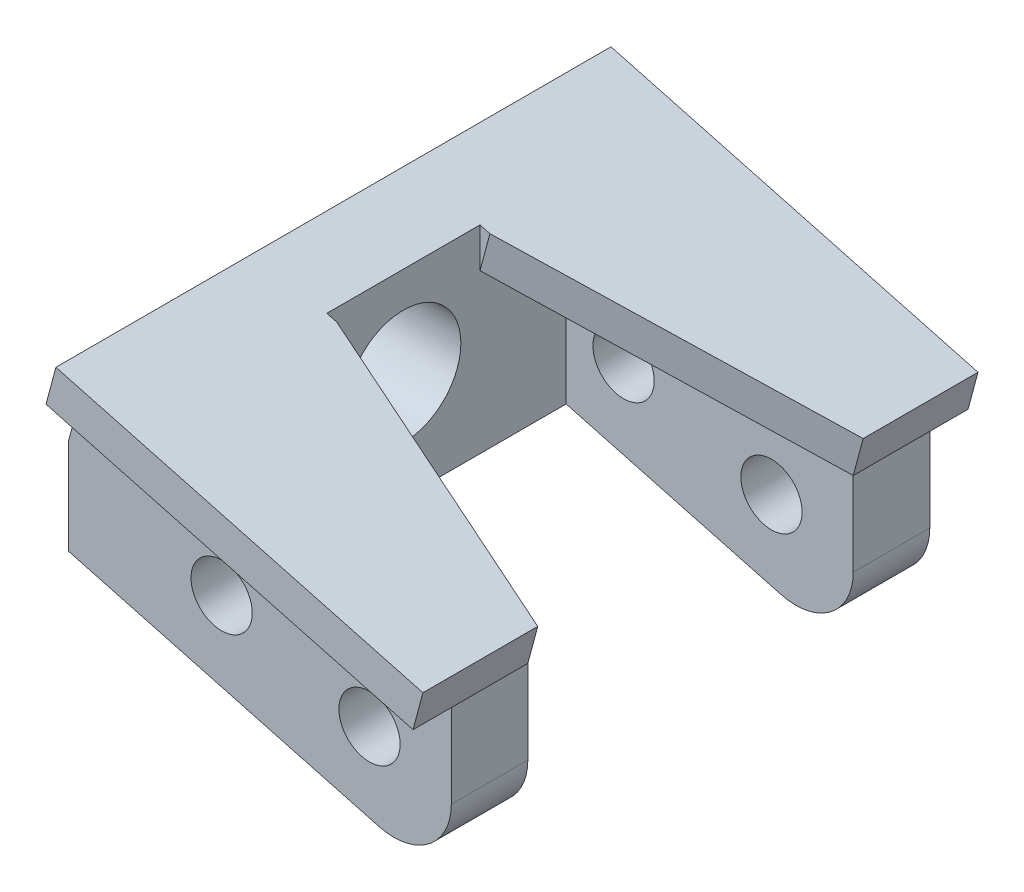
ISO-10303-21;
HEADER;
FILE_DESCRIPTION(('STEP AP214'),'2;1');
FILE_NAME('part.step','',(''),(''),'','','');
FILE_SCHEMA(('AUTOMOTIVE_DESIGN { 1 0 10303 214 1 1 1 1 }'));
ENDSEC;
DATA;
#1=APPLICATION_CONTEXT('core data for automotive mechanical design processes');
#2=APPLICATION_PROTOCOL_DEFINITION('international standard','automotive_design',2000,#1);
#3=PRODUCT_CONTEXT('',#1,'mechanical');
#4=PRODUCT('Part','Part','',(#3));
#5=PRODUCT_RELATED_PRODUCT_CATEGORY('part','',(#4));
#6=PRODUCT_DEFINITION_FORMATION('','',#4);
#7=PRODUCT_DEFINITION_CONTEXT('part definition',#1,'design');
#8=PRODUCT_DEFINITION('design','',#6,#7);
#9=PRODUCT_DEFINITION_SHAPE('','',#8);
#10=(LENGTH_UNIT() NAMED_UNIT(*) SI_UNIT(.MILLI.,.METRE.));
#11=(NAMED_UNIT(*) PLANE_ANGLE_UNIT() SI_UNIT($,.RADIAN.));
#12=(NAMED_UNIT(*) SI_UNIT($,.STERADIAN.) SOLID_ANGLE_UNIT());
#13=UNCERTAINTY_MEASURE_WITH_UNIT(LENGTH_MEASURE(1.E-05),#10,'distance_accuracy_value','');
#14=(GEOMETRIC_REPRESENTATION_CONTEXT(3) GLOBAL_UNCERTAINTY_ASSIGNED_CONTEXT((#13)) GLOBAL_UNIT_ASSIGNED_CONTEXT((#10,
#11,#12)) REPRESENTATION_CONTEXT('',''));
#15=CARTESIAN_POINT('',(0.,0.,0.));
#16=DIRECTION('',(0.,0.,1.));
#17=DIRECTION('',(1.,0.,0.));
#18=AXIS2_PLACEMENT_3D('',#15,#16,#17);
#19=CARTESIAN_POINT('',(1.892638090205,7.06342151298536,0.));
#20=DIRECTION('',(0.258819045102514,0.96592582628907,0.));
#21=DIRECTION('',(-0.96592582628907,0.258819045102514,0.));
#22=AXIS2_PLACEMENT_3D('',#19,#20,#21);
#23=PLANE('',#22);
#24=DIRECTION('',(-0.927758448091127,0.248592126937163,-0.278327534427338));
#25=VECTOR('',#24,1.);
#26=CARTESIAN_POINT('',(20.517638090205,2.07286780395583,8.5));
#27=LINE('',#26,#25);
#28=CARTESIAN_POINT('',(20.517638090205,2.07286780395583,8.5));
#29=VERTEX_POINT('',#28);
#30=CARTESIAN_POINT('',(5.51763809020503,6.09210569042256,4.));
#31=VERTEX_POINT('',#30);
#32=EDGE_CURVE('E205',#29,#31,#27,.T.);
#33=ORIENTED_EDGE('',*,*,#32,.T.);
#34=DIRECTION('',(-0.96592582628907,0.258819045102514,0.));
#35=VECTOR('',#34,1.);
#36=CARTESIAN_POINT('',(1.892638090205,7.06342151298536,4.));
#37=LINE('',#36,#35);
#38=CARTESIAN_POINT('',(5.,6.23080639866458,4.));
#39=VERTEX_POINT('',#38);
#40=EDGE_CURVE('E316',#31,#39,#37,.T.);
#41=ORIENTED_EDGE('',*,*,#40,.T.);
#42=DIRECTION('',(0.,0.,1.));
#43=VECTOR('',#42,1.);
#44=CARTESIAN_POINT('',(5.,6.23080639866458,0.));
#45=LINE('',#44,#43);
#46=CARTESIAN_POINT('',(5.,6.23080639866458,-4.));
#47=VERTEX_POINT('',#46);
#48=EDGE_CURVE('E178',#47,#39,#45,.T.);
#49=ORIENTED_EDGE('',*,*,#48,.F.);
#50=DIRECTION('',(0.96592582628907,-0.258819045102514,0.));
#51=VECTOR('',#50,1.);
#52=CARTESIAN_POINT('',(1.892638090205,7.06342151298536,-4.));
#53=LINE('',#52,#51);
#54=CARTESIAN_POINT('',(5.51763809020501,6.09210569042257,-4.));
#55=VERTEX_POINT('',#54);
#56=EDGE_CURVE('E175',#47,#55,#53,.T.);
#57=ORIENTED_EDGE('',*,*,#56,.T.);
#58=DIRECTION('',(0.927758448091127,-0.248592126937163,-0.278327534427338));
#59=VECTOR('',#58,1.);
#60=CARTESIAN_POINT('',(20.517638090205,2.07286780395583,-8.5));
#61=LINE('',#60,#59);
#62=CARTESIAN_POINT('',(20.517638090205,2.07286780395583,-8.5));
#63=VERTEX_POINT('',#62);
#64=EDGE_CURVE('E203',#55,#63,#61,.T.);
#65=ORIENTED_EDGE('',*,*,#64,.T.);
#66=DIRECTION('',(0.,0.,-1.));
#67=VECTOR('',#66,1.);
#68=CARTESIAN_POINT('',(20.517638090205,2.07286780395583,-8.5));
#69=LINE('',#68,#67);
#70=CARTESIAN_POINT('',(20.517638090205,2.07286780395583,-14.5));
#71=VERTEX_POINT('',#70);
#72=EDGE_CURVE('E354',#63,#71,#69,.T.);
#73=ORIENTED_EDGE('',*,*,#72,.T.);
#74=DIRECTION('',(-0.96592582628907,0.258819045102514,0.));
#75=VECTOR('',#74,1.);
#76=CARTESIAN_POINT('',(20.517638090205,2.07286780395583,-14.5));
#77=LINE('',#76,#75);
#78=CARTESIAN_POINT('',(1.34254474715799,7.21081858001654,-14.5));
#79=VERTEX_POINT('',#78);
#80=EDGE_CURVE('E358',#71,#79,#77,.T.);
#81=ORIENTED_EDGE('',*,*,#80,.T.);
#82=DIRECTION('',(0.,0.,1.));
#83=VECTOR('',#82,1.);
#84=CARTESIAN_POINT('',(1.34254474715799,7.21081858001654,-14.5));
#85=LINE('',#84,#83);
#86=CARTESIAN_POINT('',(1.34254474715799,7.21081858001654,14.5));
#87=VERTEX_POINT('',#86);
#88=EDGE_CURVE('E407',#79,#87,#85,.T.);
#89=ORIENTED_EDGE('',*,*,#88,.T.);
#90=DIRECTION('',(0.96592582628907,-0.258819045102514,0.));
#91=VECTOR('',#90,1.);
#92=CARTESIAN_POINT('',(20.517638090205,2.07286780395583,14.5));
#93=LINE('',#92,#91);
#94=CARTESIAN_POINT('',(20.517638090205,2.07286780395583,14.5));
#95=VERTEX_POINT('',#94);
#96=EDGE_CURVE('E365',#87,#95,#93,.T.);
#97=ORIENTED_EDGE('',*,*,#96,.T.);
#98=DIRECTION('',(0.,0.,-1.));
#99=VECTOR('',#98,1.);
#100=CARTESIAN_POINT('',(20.517638090205,2.07286780395583,8.5));
#101=LINE('',#100,#99);
#102=EDGE_CURVE('E366',#95,#29,#101,.T.);
#103=ORIENTED_EDGE('',*,*,#102,.T.);
#104=EDGE_LOOP('',(#33,#41,#49,#57,#65,#73,#81,#89,#97,#103));
#105=FACE_BOUND('',#104,.T.);
#106=ADVANCED_FACE('F34',(#105),#23,.T.);
#107=CARTESIAN_POINT('',(5.,0.,0.));
#108=DIRECTION('',(1.,0.,0.));
#109=DIRECTION('',(0.,0.,-1.));
#110=AXIS2_PLACEMENT_3D('',#107,#108,#109);
#111=PLANE('',#110);
#112=DIRECTION('',(0.,-1.,0.));
#113=VECTOR('',#112,1.);
#114=CARTESIAN_POINT('',(5.,0.486029968612696,4.));
#115=LINE('',#114,#113);
#116=CARTESIAN_POINT('',(5.,4.16025403784442,4.));
#117=VERTEX_POINT('',#116);
#118=EDGE_CURVE('E179',#39,#117,#115,.T.);
#119=ORIENTED_EDGE('',*,*,#118,.T.);
#120=DIRECTION('',(0.,0.,-1.));
#121=VECTOR('',#120,1.);
#122=CARTESIAN_POINT('',(5.,4.16025403784442,0.));
#123=LINE('',#122,#121);
#124=CARTESIAN_POINT('',(5.,4.16025403784442,8.5));
#125=VERTEX_POINT('',#124);
#126=EDGE_CURVE('E193',#125,#117,#123,.T.);
#127=ORIENTED_EDGE('',*,*,#126,.F.);
#128=DIRECTION('',(0.,1.,0.));
#129=VECTOR('',#128,1.);
#130=CARTESIAN_POINT('',(5.,-9.5,8.5));
#131=LINE('',#130,#129);
#132=CARTESIAN_POINT('',(5.,-4.12195540543623,8.5));
#133=VERTEX_POINT('',#132);
#134=EDGE_CURVE('E301',#133,#125,#131,.T.);
#135=ORIENTED_EDGE('',*,*,#134,.F.);
#136=DIRECTION('',(0.,0.,1.));
#137=VECTOR('',#136,1.);
#138=CARTESIAN_POINT('',(5.,-4.12195540543623,0.));
#139=LINE('',#138,#137);
#140=CARTESIAN_POINT('',(5.,-4.12195540543623,-8.5));
#141=VERTEX_POINT('',#140);
#142=EDGE_CURVE('E277',#141,#133,#139,.T.);
#143=ORIENTED_EDGE('',*,*,#142,.F.);
#144=DIRECTION('',(0.,-1.,0.));
#145=VECTOR('',#144,1.);
#146=CARTESIAN_POINT('',(5.,-9.5,-8.5));
#147=LINE('',#146,#145);
#148=CARTESIAN_POINT('',(5.,4.16025403784442,-8.5));
#149=VERTEX_POINT('',#148);
#150=EDGE_CURVE('E189',#149,#141,#147,.T.);
#151=ORIENTED_EDGE('',*,*,#150,.F.);
#152=CARTESIAN_POINT('',(5.,4.16025403784442,-4.));
#153=VERTEX_POINT('',#152);
#154=EDGE_CURVE('E183',#153,#149,#123,.T.);
#155=ORIENTED_EDGE('',*,*,#154,.F.);
#156=DIRECTION('',(0.,1.,0.));
#157=VECTOR('',#156,1.);
#158=CARTESIAN_POINT('',(5.,6.74992068412596,-4.));
#159=LINE('',#158,#157);
#160=EDGE_CURVE('E169',#153,#47,#159,.T.);
#161=ORIENTED_EDGE('',*,*,#160,.T.);
#162=ORIENTED_EDGE('',*,*,#48,.T.);
#163=EDGE_LOOP('',(#119,#127,#135,#143,#151,#155,#161,#162));
#164=FACE_BOUND('',#163,.T.);
#165=CARTESIAN_POINT('',(5.,1.37804459456377,0.));
#166=DIRECTION('',(1.,0.,0.));
#167=DIRECTION('',(0.,0.,-1.));
#168=AXIS2_PLACEMENT_3D('',#165,#166,#167);
#169=CIRCLE('',#168,3.);
#170=CARTESIAN_POINT('',(5.,1.37804459456377,-3.));
#171=VERTEX_POINT('',#170);
#172=EDGE_CURVE('E420',#171,#171,#169,.T.);
#173=ORIENTED_EDGE('',*,*,#172,.F.);
#174=EDGE_LOOP('',(#173));
#175=FACE_BOUND('',#174,.T.);
#176=ADVANCED_FACE('F185',(#164,#175),#111,.T.);
#177=CARTESIAN_POINT('',(5.,-5.5,12.5));
#178=DIRECTION('',(0.,0.,-1.));
#179=DIRECTION('',(-1.,0.,0.));
#180=AXIS2_PLACEMENT_3D('',#177,#178,#179);
#181=PLANE('',#180);
#182=CARTESIAN_POINT('',(8.,-0.784698261089253,12.5));
#183=DIRECTION('',(0.,0.,1.));
#184=DIRECTION('',(1.,0.,0.));
#185=AXIS2_PLACEMENT_3D('',#182,#183,#184);
#186=CIRCLE('',#185,1.6);
#187=CARTESIAN_POINT('',(9.6,-0.784698261089253,12.5));
#188=VERTEX_POINT('',#187);
#189=EDGE_CURVE('E252',#188,#188,#186,.T.);
#190=ORIENTED_EDGE('',*,*,#189,.F.);
#191=EDGE_LOOP('',(#190));
#192=FACE_BOUND('',#191,.T.);
#193=CARTESIAN_POINT('',(15.7274066103126,-2.85525062190937,12.5));
#194=DIRECTION('',(0.,0.,1.));
#195=DIRECTION('',(1.,0.,0.));
#196=AXIS2_PLACEMENT_3D('',#193,#194,#195);
#197=CIRCLE('',#196,1.6);
#198=CARTESIAN_POINT('',(17.3274066103126,-2.85525062190937,12.5));
#199=VERTEX_POINT('',#198);
#200=EDGE_CURVE('E256',#199,#199,#197,.T.);
#201=ORIENTED_EDGE('',*,*,#200,.F.);
#202=EDGE_LOOP('',(#201));
#203=FACE_BOUND('',#202,.T.);
#204=DIRECTION('',(-0.96592582628907,0.258819045102514,0.));
#205=VECTOR('',#204,1.);
#206=CARTESIAN_POINT('',(0.,-2.78220944328066,12.5));
#207=LINE('',#206,#205);
#208=CARTESIAN_POINT('',(16.2235428646925,-7.12929465224658,12.5));
#209=VERTEX_POINT('',#208);
#210=CARTESIAN_POINT('',(0.,-2.78220944328066,12.5));
#211=VERTEX_POINT('',#210);
#212=EDGE_CURVE('E242',#209,#211,#207,.T.);
#213=ORIENTED_EDGE('',*,*,#212,.F.);
#214=CARTESIAN_POINT('',(17.,-4.23151717337937,12.5));
#215=DIRECTION('',(0.,0.,-1.));
#216=DIRECTION('',(-1.,0.,0.));
#217=AXIS2_PLACEMENT_3D('',#214,#215,#216);
#218=CIRCLE('',#217,3.);
#219=CARTESIAN_POINT('',(20.,-4.23151717337937,12.5));
#220=VERTEX_POINT('',#219);
#221=EDGE_CURVE('E56',#209,#220,#218,.F.);
#222=ORIENTED_EDGE('',*,*,#221,.T.);
#223=DIRECTION('',(0.,-1.,0.));
#224=VECTOR('',#223,1.);
#225=CARTESIAN_POINT('',(20.,-9.5,12.5));
#226=LINE('',#225,#224);
#227=CARTESIAN_POINT('',(20.,0.141016151377685,12.5));
#228=VERTEX_POINT('',#227);
#229=EDGE_CURVE('E295',#228,#220,#226,.T.);
#230=ORIENTED_EDGE('',*,*,#229,.F.);
#231=DIRECTION('',(0.96592582628907,-0.258819045102514,0.));
#232=VECTOR('',#231,1.);
#233=CARTESIAN_POINT('',(0.,5.5,12.5));
#234=LINE('',#233,#232);
#235=CARTESIAN_POINT('',(0.824906656952962,5.2789669274384,12.5));
#236=VERTEX_POINT('',#235);
#237=EDGE_CURVE('E247',#236,#228,#234,.T.);
#238=ORIENTED_EDGE('',*,*,#237,.F.);
#239=DIRECTION('',(-0.258819045102514,-0.96592582628907,0.));
#240=VECTOR('',#239,1.);
#241=CARTESIAN_POINT('',(-1.59015685250809,-3.73417279337608,12.5));
#242=LINE('',#241,#240);
#243=CARTESIAN_POINT('',(0.,2.20037337218807,12.5));
#244=VERTEX_POINT('',#243);
#245=EDGE_CURVE('E210',#236,#244,#242,.T.);
#246=ORIENTED_EDGE('',*,*,#245,.T.);
#247=DIRECTION('',(0.,-1.,0.));
#248=VECTOR('',#247,1.);
#249=CARTESIAN_POINT('',(0.,-5.5,12.5));
#250=LINE('',#249,#248);
#251=EDGE_CURVE('E300',#244,#211,#250,.T.);
#252=ORIENTED_EDGE('',*,*,#251,.T.);
#253=EDGE_LOOP('',(#213,#222,#230,#238,#246,#252));
#254=FACE_BOUND('',#253,.T.);
#255=ADVANCED_FACE('F392',(#192,#203,#254),#181,.F.);
#256=CARTESIAN_POINT('',(5.,-5.5,-12.5));
#257=DIRECTION('',(0.,0.,1.));
#258=DIRECTION('',(1.,0.,0.));
#259=AXIS2_PLACEMENT_3D('',#256,#257,#258);
#260=PLANE('',#259);
#261=CARTESIAN_POINT('',(8.,-0.784698261089253,-12.5));
#262=DIRECTION('',(0.,0.,1.));
#263=DIRECTION('',(1.,0.,0.));
#264=AXIS2_PLACEMENT_3D('',#261,#262,#263);
#265=CIRCLE('',#264,1.6);
#266=CARTESIAN_POINT('',(9.6,-0.784698261089253,-12.5));
#267=VERTEX_POINT('',#266);
#268=EDGE_CURVE('E253',#267,#267,#265,.T.);
#269=ORIENTED_EDGE('',*,*,#268,.T.);
#270=EDGE_LOOP('',(#269));
#271=FACE_BOUND('',#270,.T.);
#272=CARTESIAN_POINT('',(15.7274066103126,-2.85525062190937,-12.5));
#273=DIRECTION('',(0.,0.,1.));
#274=DIRECTION('',(1.,0.,0.));
#275=AXIS2_PLACEMENT_3D('',#272,#273,#274);
#276=CIRCLE('',#275,1.6);
#277=CARTESIAN_POINT('',(17.3274066103126,-2.85525062190937,-12.5));
#278=VERTEX_POINT('',#277);
#279=EDGE_CURVE('E264',#278,#278,#276,.T.);
#280=ORIENTED_EDGE('',*,*,#279,.T.);
#281=EDGE_LOOP('',(#280));
#282=FACE_BOUND('',#281,.T.);
#283=DIRECTION('',(0.,1.,0.));
#284=VECTOR('',#283,1.);
#285=CARTESIAN_POINT('',(20.,-9.5,-12.5));
#286=LINE('',#285,#284);
#287=CARTESIAN_POINT('',(20.,-4.23151717337937,-12.5));
#288=VERTEX_POINT('',#287);
#289=CARTESIAN_POINT('',(20.,0.141016151377685,-12.5));
#290=VERTEX_POINT('',#289);
#291=EDGE_CURVE('E293',#288,#290,#286,.T.);
#292=ORIENTED_EDGE('',*,*,#291,.F.);
#293=CARTESIAN_POINT('',(17.,-4.23151717337937,-12.5));
#294=DIRECTION('',(0.,0.,1.));
#295=DIRECTION('',(1.,0.,0.));
#296=AXIS2_PLACEMENT_3D('',#293,#294,#295);
#297=CIRCLE('',#296,3.);
#298=CARTESIAN_POINT('',(16.2235428646925,-7.12929465224658,-12.5));
#299=VERTEX_POINT('',#298);
#300=EDGE_CURVE('E329',#288,#299,#297,.F.);
#301=ORIENTED_EDGE('',*,*,#300,.T.);
#302=DIRECTION('',(-0.96592582628907,0.258819045102514,0.));
#303=VECTOR('',#302,1.);
#304=CARTESIAN_POINT('',(0.,-2.78220944328066,-12.5));
#305=LINE('',#304,#303);
#306=CARTESIAN_POINT('',(0.,-2.78220944328066,-12.5));
#307=VERTEX_POINT('',#306);
#308=EDGE_CURVE('E259',#299,#307,#305,.T.);
#309=ORIENTED_EDGE('',*,*,#308,.T.);
#310=DIRECTION('',(0.,1.,0.));
#311=VECTOR('',#310,1.);
#312=CARTESIAN_POINT('',(0.,-5.5,-12.5));
#313=LINE('',#312,#311);
#314=CARTESIAN_POINT('',(0.,2.20037337218807,-12.5));
#315=VERTEX_POINT('',#314);
#316=EDGE_CURVE('E305',#307,#315,#313,.T.);
#317=ORIENTED_EDGE('',*,*,#316,.T.);
#318=DIRECTION('',(0.258819045102514,0.96592582628907,0.));
#319=VECTOR('',#318,1.);
#320=CARTESIAN_POINT('',(-1.59015685250808,-3.73417279337607,-12.5));
#321=LINE('',#320,#319);
#322=CARTESIAN_POINT('',(0.824906656952962,5.2789669274384,-12.5));
#323=VERTEX_POINT('',#322);
#324=EDGE_CURVE('E400',#315,#323,#321,.T.);
#325=ORIENTED_EDGE('',*,*,#324,.T.);
#326=DIRECTION('',(0.96592582628907,-0.258819045102514,0.));
#327=VECTOR('',#326,1.);
#328=CARTESIAN_POINT('',(0.,5.5,-12.5));
#329=LINE('',#328,#327);
#330=EDGE_CURVE('E243',#323,#290,#329,.T.);
#331=ORIENTED_EDGE('',*,*,#330,.T.);
#332=EDGE_LOOP('',(#292,#301,#309,#317,#325,#331));
#333=FACE_BOUND('',#332,.T.);
#334=ADVANCED_FACE('F335',(#271,#282,#333),#260,.F.);
#335=CARTESIAN_POINT('',(0.,0.,0.));
#336=DIRECTION('',(1.,0.,0.));
#337=DIRECTION('',(0.,0.,-1.));
#338=AXIS2_PLACEMENT_3D('',#335,#336,#337);
#339=PLANE('',#338);
#340=DIRECTION('',(0.,0.,1.));
#341=VECTOR('',#340,1.);
#342=CARTESIAN_POINT('',(0.,2.20037337218807,-14.5));
#343=LINE('',#342,#341);
#344=CARTESIAN_POINT('',(0.,2.20037337218807,2.88509538516336));
#345=VERTEX_POINT('',#344);
#346=EDGE_CURVE('E411',#345,#244,#343,.T.);
#347=ORIENTED_EDGE('',*,*,#346,.F.);
#348=CARTESIAN_POINT('',(0.,1.37804459456377,0.));
#349=DIRECTION('',(1.,0.,0.));
#350=DIRECTION('',(0.,0.,-1.));
#351=AXIS2_PLACEMENT_3D('',#348,#349,#350);
#352=CIRCLE('',#351,3.);
#353=CARTESIAN_POINT('',(0.,2.20037337218807,-2.88509538516336));
#354=VERTEX_POINT('',#353);
#355=EDGE_CURVE('E417',#345,#354,#352,.T.);
#356=ORIENTED_EDGE('',*,*,#355,.T.);
#357=EDGE_CURVE('E408',#315,#354,#343,.T.);
#358=ORIENTED_EDGE('',*,*,#357,.F.);
#359=ORIENTED_EDGE('',*,*,#316,.F.);
#360=DIRECTION('',(0.,0.,1.));
#361=VECTOR('',#360,1.);
#362=CARTESIAN_POINT('',(0.,-2.78220944328066,-12.5));
#363=LINE('',#362,#361);
#364=EDGE_CURVE('E249',#307,#211,#363,.T.);
#365=ORIENTED_EDGE('',*,*,#364,.T.);
#366=ORIENTED_EDGE('',*,*,#251,.F.);
#367=EDGE_LOOP('',(#347,#356,#358,#359,#365,#366));
#368=FACE_BOUND('',#367,.T.);
#369=ADVANCED_FACE('F429',(#368),#339,.F.);
#370=CARTESIAN_POINT('',(20.,-9.5,8.5));
#371=DIRECTION('',(0.,0.,1.));
#372=DIRECTION('',(1.,0.,0.));
#373=AXIS2_PLACEMENT_3D('',#370,#371,#372);
#374=PLANE('',#373);
#375=CARTESIAN_POINT('',(8.,-0.784698261089253,8.5));
#376=DIRECTION('',(0.,0.,1.));
#377=DIRECTION('',(1.,0.,0.));
#378=AXIS2_PLACEMENT_3D('',#375,#376,#377);
#379=CIRCLE('',#378,1.6);
#380=CARTESIAN_POINT('',(9.6,-0.784698261089253,8.5));
#381=VERTEX_POINT('',#380);
#382=EDGE_CURVE('E287',#381,#381,#379,.T.);
#383=ORIENTED_EDGE('',*,*,#382,.T.);
#384=EDGE_LOOP('',(#383));
#385=FACE_BOUND('',#384,.T.);
#386=CARTESIAN_POINT('',(15.7274066103126,-2.85525062190937,8.5));
#387=DIRECTION('',(0.,0.,1.));
#388=DIRECTION('',(1.,0.,0.));
#389=AXIS2_PLACEMENT_3D('',#386,#387,#388);
#390=CIRCLE('',#389,1.6);
#391=CARTESIAN_POINT('',(17.3274066103126,-2.85525062190937,8.5));
#392=VERTEX_POINT('',#391);
#393=EDGE_CURVE('E283',#392,#392,#390,.T.);
#394=ORIENTED_EDGE('',*,*,#393,.T.);
#395=EDGE_LOOP('',(#394));
#396=FACE_BOUND('',#395,.T.);
#397=DIRECTION('',(0.,1.,0.));
#398=VECTOR('',#397,1.);
#399=CARTESIAN_POINT('',(20.,-9.5,8.5));
#400=LINE('',#399,#398);
#401=CARTESIAN_POINT('',(20.,-4.23151717337937,8.5));
#402=VERTEX_POINT('',#401);
#403=CARTESIAN_POINT('',(20.,0.141016151377685,8.5));
#404=VERTEX_POINT('',#403);
#405=EDGE_CURVE('E298',#402,#404,#400,.T.);
#406=ORIENTED_EDGE('',*,*,#405,.F.);
#407=CARTESIAN_POINT('',(17.,-4.23151717337937,8.5));
#408=DIRECTION('',(0.,0.,1.));
#409=DIRECTION('',(1.,0.,0.));
#410=AXIS2_PLACEMENT_3D('',#407,#408,#409);
#411=CIRCLE('',#410,3.);
#412=CARTESIAN_POINT('',(16.2235428646925,-7.12929465224658,8.5));
#413=VERTEX_POINT('',#412);
#414=EDGE_CURVE('E11',#402,#413,#411,.F.);
#415=ORIENTED_EDGE('',*,*,#414,.T.);
#416=DIRECTION('',(-0.96592582628907,0.258819045102514,0.));
#417=VECTOR('',#416,1.);
#418=CARTESIAN_POINT('',(20.3397016770243,-8.2322160819291,8.5));
#419=LINE('',#418,#417);
#420=EDGE_CURVE('E280',#413,#133,#419,.T.);
#421=ORIENTED_EDGE('',*,*,#420,.T.);
#422=ORIENTED_EDGE('',*,*,#134,.T.);
#423=DIRECTION('',(0.96592582628907,-0.258819045102514,0.));
#424=VECTOR('',#423,1.);
#425=CARTESIAN_POINT('',(22.4102540378444,-0.504809471616548,8.5));
#426=LINE('',#425,#424);
#427=EDGE_CURVE('E271',#125,#404,#426,.T.);
#428=ORIENTED_EDGE('',*,*,#427,.T.);
#429=EDGE_LOOP('',(#406,#415,#421,#422,#428));
#430=FACE_BOUND('',#429,.T.);
#431=ADVANCED_FACE('F384',(#385,#396,#430),#374,.F.);
#432=CARTESIAN_POINT('',(20.,0.,0.));
#433=DIRECTION('',(1.,0.,0.));
#434=DIRECTION('',(0.,0.,-1.));
#435=AXIS2_PLACEMENT_3D('',#432,#433,#434);
#436=PLANE('',#435);
#437=ORIENTED_EDGE('',*,*,#229,.T.);
#438=DIRECTION('',(0.,0.,1.));
#439=VECTOR('',#438,1.);
#440=CARTESIAN_POINT('',(20.,-4.23151717337937,8.5));
#441=LINE('',#440,#439);
#442=EDGE_CURVE('E42',#220,#402,#441,.F.);
#443=ORIENTED_EDGE('',*,*,#442,.T.);
#444=ORIENTED_EDGE('',*,*,#405,.T.);
#445=DIRECTION('',(0.,0.,1.));
#446=VECTOR('',#445,1.);
#447=CARTESIAN_POINT('',(20.,0.141016151377685,-12.5));
#448=LINE('',#447,#446);
#449=EDGE_CURVE('E246',#404,#228,#448,.T.);
#450=ORIENTED_EDGE('',*,*,#449,.T.);
#451=EDGE_LOOP('',(#437,#443,#444,#450));
#452=FACE_BOUND('',#451,.T.);
#453=ADVANCED_FACE('F390',(#452),#436,.T.);
#454=CARTESIAN_POINT('',(20.,-9.5,-8.5));
#455=DIRECTION('',(0.,0.,-1.));
#456=DIRECTION('',(-1.,0.,0.));
#457=AXIS2_PLACEMENT_3D('',#454,#455,#456);
#458=PLANE('',#457);
#459=CARTESIAN_POINT('',(8.,-0.784698261089253,-8.5));
#460=DIRECTION('',(0.,0.,-1.));
#461=DIRECTION('',(-1.,0.,0.));
#462=AXIS2_PLACEMENT_3D('',#459,#460,#461);
#463=CIRCLE('',#462,1.6);
#464=CARTESIAN_POINT('',(6.4,-0.784698261089253,-8.5));
#465=VERTEX_POINT('',#464);
#466=EDGE_CURVE('E286',#465,#465,#463,.T.);
#467=ORIENTED_EDGE('',*,*,#466,.T.);
#468=EDGE_LOOP('',(#467));
#469=FACE_BOUND('',#468,.T.);
#470=CARTESIAN_POINT('',(15.7274066103126,-2.85525062190937,-8.5));
#471=DIRECTION('',(0.,0.,-1.));
#472=DIRECTION('',(-1.,0.,0.));
#473=AXIS2_PLACEMENT_3D('',#470,#471,#472);
#474=CIRCLE('',#473,1.6);
#475=CARTESIAN_POINT('',(14.1274066103126,-2.85525062190937,-8.5));
#476=VERTEX_POINT('',#475);
#477=EDGE_CURVE('E282',#476,#476,#474,.T.);
#478=ORIENTED_EDGE('',*,*,#477,.T.);
#479=EDGE_LOOP('',(#478));
#480=FACE_BOUND('',#479,.T.);
#481=DIRECTION('',(0.96592582628907,-0.258819045102514,0.));
#482=VECTOR('',#481,1.);
#483=CARTESIAN_POINT('',(20.3397016770243,-8.2322160819291,-8.5));
#484=LINE('',#483,#482);
#485=CARTESIAN_POINT('',(16.2235428646925,-7.12929465224658,-8.5));
#486=VERTEX_POINT('',#485);
#487=EDGE_CURVE('E274',#141,#486,#484,.T.);
#488=ORIENTED_EDGE('',*,*,#487,.T.);
#489=CARTESIAN_POINT('',(17.,-4.23151717337937,-8.5));
#490=DIRECTION('',(0.,0.,-1.));
#491=DIRECTION('',(-1.,0.,0.));
#492=AXIS2_PLACEMENT_3D('',#489,#490,#491);
#493=CIRCLE('',#492,3.);
#494=CARTESIAN_POINT('',(20.,-4.23151717337937,-8.5));
#495=VERTEX_POINT('',#494);
#496=EDGE_CURVE('E325',#486,#495,#493,.F.);
#497=ORIENTED_EDGE('',*,*,#496,.T.);
#498=DIRECTION('',(0.,-1.,0.));
#499=VECTOR('',#498,1.);
#500=CARTESIAN_POINT('',(20.,-9.5,-8.5));
#501=LINE('',#500,#499);
#502=CARTESIAN_POINT('',(20.,0.141016151377685,-8.5));
#503=VERTEX_POINT('',#502);
#504=EDGE_CURVE('E290',#503,#495,#501,.T.);
#505=ORIENTED_EDGE('',*,*,#504,.F.);
#506=DIRECTION('',(-0.96592582628907,0.258819045102514,0.));
#507=VECTOR('',#506,1.);
#508=CARTESIAN_POINT('',(22.4102540378444,-0.504809471616548,-8.5));
#509=LINE('',#508,#507);
#510=EDGE_CURVE('E194',#503,#149,#509,.T.);
#511=ORIENTED_EDGE('',*,*,#510,.T.);
#512=ORIENTED_EDGE('',*,*,#150,.T.);
#513=EDGE_LOOP('',(#488,#497,#505,#511,#512));
#514=FACE_BOUND('',#513,.T.);
#515=ADVANCED_FACE('F346',(#469,#480,#514),#458,.F.);
#516=CARTESIAN_POINT('',(20.,0.,0.));
#517=DIRECTION('',(-1.,0.,0.));
#518=DIRECTION('',(0.,0.,1.));
#519=AXIS2_PLACEMENT_3D('',#516,#517,#518);
#520=PLANE('',#519);
#521=ORIENTED_EDGE('',*,*,#504,.T.);
#522=DIRECTION('',(0.,0.,1.));
#523=VECTOR('',#522,1.);
#524=CARTESIAN_POINT('',(20.,-4.23151717337937,0.));
#525=LINE('',#524,#523);
#526=EDGE_CURVE('E327',#495,#288,#525,.F.);
#527=ORIENTED_EDGE('',*,*,#526,.T.);
#528=ORIENTED_EDGE('',*,*,#291,.T.);
#529=EDGE_CURVE('E250',#290,#503,#448,.T.);
#530=ORIENTED_EDGE('',*,*,#529,.T.);
#531=EDGE_LOOP('',(#521,#527,#528,#530));
#532=FACE_BOUND('',#531,.T.);
#533=ADVANCED_FACE('F348',(#532),#520,.F.);
#534=CARTESIAN_POINT('',(0.,-2.78220944328066,-12.5));
#535=DIRECTION('',(0.258819045102514,0.96592582628907,0.));
#536=DIRECTION('',(-0.96592582628907,0.258819045102514,0.));
#537=AXIS2_PLACEMENT_3D('',#534,#535,#536);
#538=PLANE('',#537);
#539=ORIENTED_EDGE('',*,*,#308,.F.);
#540=DIRECTION('',(0.,0.,1.));
#541=VECTOR('',#540,1.);
#542=CARTESIAN_POINT('',(16.2235428646925,-7.12929465224658,-12.5));
#543=LINE('',#542,#541);
#544=EDGE_CURVE('E322',#299,#486,#543,.T.);
#545=ORIENTED_EDGE('',*,*,#544,.T.);
#546=ORIENTED_EDGE('',*,*,#487,.F.);
#547=ORIENTED_EDGE('',*,*,#142,.T.);
#548=ORIENTED_EDGE('',*,*,#420,.F.);
#549=DIRECTION('',(0.,0.,1.));
#550=VECTOR('',#549,1.);
#551=CARTESIAN_POINT('',(16.2235428646925,-7.12929465224658,12.5));
#552=LINE('',#551,#550);
#553=EDGE_CURVE('E319',#413,#209,#552,.T.);
#554=ORIENTED_EDGE('',*,*,#553,.T.);
#555=ORIENTED_EDGE('',*,*,#212,.T.);
#556=ORIENTED_EDGE('',*,*,#364,.F.);
#557=EDGE_LOOP('',(#539,#545,#546,#547,#548,#554,#555,#556));
#558=FACE_BOUND('',#557,.T.);
#559=ADVANCED_FACE('F341',(#558),#538,.F.);
#560=CARTESIAN_POINT('',(15.7274066103126,-2.85525062190937,-12.5));
#561=DIRECTION('',(0.,0.,1.));
#562=DIRECTION('',(1.,0.,0.));
#563=AXIS2_PLACEMENT_3D('',#560,#561,#562);
#564=CYLINDRICAL_SURFACE('',#563,1.6);
#565=ORIENTED_EDGE('',*,*,#279,.F.);
#566=EDGE_LOOP('',(#565));
#567=FACE_BOUND('',#566,.T.);
#568=ORIENTED_EDGE('',*,*,#477,.F.);
#569=EDGE_LOOP('',(#568));
#570=FACE_BOUND('',#569,.T.);
#571=ADVANCED_FACE('F604',(#567,#570),#564,.F.);
#572=CARTESIAN_POINT('',(8.,-0.784698261089253,-12.5));
#573=DIRECTION('',(0.,0.,1.));
#574=DIRECTION('',(1.,0.,0.));
#575=AXIS2_PLACEMENT_3D('',#572,#573,#574);
#576=CYLINDRICAL_SURFACE('',#575,1.6);
#577=ORIENTED_EDGE('',*,*,#268,.F.);
#578=EDGE_LOOP('',(#577));
#579=FACE_BOUND('',#578,.T.);
#580=ORIENTED_EDGE('',*,*,#466,.F.);
#581=EDGE_LOOP('',(#580));
#582=FACE_BOUND('',#581,.T.);
#583=ADVANCED_FACE('F595',(#579,#582),#576,.F.);
#584=ORIENTED_EDGE('',*,*,#200,.T.);
#585=EDGE_LOOP('',(#584));
#586=FACE_BOUND('',#585,.T.);
#587=ORIENTED_EDGE('',*,*,#393,.F.);
#588=EDGE_LOOP('',(#587));
#589=FACE_BOUND('',#588,.T.);
#590=ADVANCED_FACE('F592',(#586,#589),#564,.F.);
#591=ORIENTED_EDGE('',*,*,#189,.T.);
#592=EDGE_LOOP('',(#591));
#593=FACE_BOUND('',#592,.T.);
#594=ORIENTED_EDGE('',*,*,#382,.F.);
#595=EDGE_LOOP('',(#594));
#596=FACE_BOUND('',#595,.T.);
#597=ADVANCED_FACE('F586',(#593,#596),#576,.F.);
#598=CARTESIAN_POINT('',(1.37499999999997,5.13156986040722,0.));
#599=DIRECTION('',(0.258819045102514,0.96592582628907,0.));
#600=DIRECTION('',(-0.96592582628907,0.258819045102514,0.));
#601=AXIS2_PLACEMENT_3D('',#598,#599,#600);
#602=PLANE('',#601);
#603=DIRECTION('',(0.96592582628907,-0.258819045102514,0.));
#604=VECTOR('',#603,1.);
#605=CARTESIAN_POINT('',(20.,0.141016151377686,14.5));
#606=LINE('',#605,#604);
#607=CARTESIAN_POINT('',(0.824906656952962,5.2789669274384,14.5));
#608=VERTEX_POINT('',#607);
#609=CARTESIAN_POINT('',(20.,0.141016151377686,14.5));
#610=VERTEX_POINT('',#609);
#611=EDGE_CURVE('E222',#608,#610,#606,.T.);
#612=ORIENTED_EDGE('',*,*,#611,.F.);
#613=DIRECTION('',(0.,0.,-1.));
#614=VECTOR('',#613,1.);
#615=CARTESIAN_POINT('',(0.824906656952962,5.2789669274384,0.));
#616=LINE('',#615,#614);
#617=EDGE_CURVE('E215',#608,#236,#616,.T.);
#618=ORIENTED_EDGE('',*,*,#617,.T.);
#619=ORIENTED_EDGE('',*,*,#237,.T.);
#620=DIRECTION('',(0.,0.,-1.));
#621=VECTOR('',#620,1.);
#622=CARTESIAN_POINT('',(20.,0.141016151377686,8.5));
#623=LINE('',#622,#621);
#624=EDGE_CURVE('E224',#610,#228,#623,.T.);
#625=ORIENTED_EDGE('',*,*,#624,.F.);
#626=EDGE_LOOP('',(#612,#618,#619,#625));
#627=FACE_BOUND('',#626,.T.);
#628=ADVANCED_FACE('F397',(#627),#602,.F.);
#629=ORIENTED_EDGE('',*,*,#330,.F.);
#630=DIRECTION('',(0.,0.,-1.));
#631=VECTOR('',#630,1.);
#632=CARTESIAN_POINT('',(0.824906656952962,5.2789669274384,0.));
#633=LINE('',#632,#631);
#634=CARTESIAN_POINT('',(0.824906656952962,5.2789669274384,-14.5));
#635=VERTEX_POINT('',#634);
#636=EDGE_CURVE('E402',#323,#635,#633,.T.);
#637=ORIENTED_EDGE('',*,*,#636,.T.);
#638=DIRECTION('',(-0.96592582628907,0.258819045102514,0.));
#639=VECTOR('',#638,1.);
#640=CARTESIAN_POINT('',(20.,0.141016151377686,-14.5));
#641=LINE('',#640,#639);
#642=CARTESIAN_POINT('',(20.,0.141016151377686,-14.5));
#643=VERTEX_POINT('',#642);
#644=EDGE_CURVE('E212',#643,#635,#641,.T.);
#645=ORIENTED_EDGE('',*,*,#644,.F.);
#646=DIRECTION('',(0.,0.,-1.));
#647=VECTOR('',#646,1.);
#648=CARTESIAN_POINT('',(20.,0.141016151377686,-8.5));
#649=LINE('',#648,#647);
#650=EDGE_CURVE('E209',#290,#643,#649,.T.);
#651=ORIENTED_EDGE('',*,*,#650,.F.);
#652=EDGE_LOOP('',(#629,#637,#645,#651));
#653=FACE_BOUND('',#652,.T.);
#654=ADVANCED_FACE('F434',(#653),#602,.F.);
#655=ORIENTED_EDGE('',*,*,#126,.T.);
#656=DIRECTION('',(-0.927758448091127,0.248592126937163,-0.278327534427338));
#657=VECTOR('',#656,1.);
#658=CARTESIAN_POINT('',(20.,0.141016151377686,8.5));
#659=LINE('',#658,#657);
#660=EDGE_CURVE('E227',#404,#117,#659,.T.);
#661=ORIENTED_EDGE('',*,*,#660,.F.);
#662=ORIENTED_EDGE('',*,*,#427,.F.);
#663=EDGE_LOOP('',(#655,#661,#662));
#664=FACE_BOUND('',#663,.T.);
#665=ADVANCED_FACE('F381',(#664),#602,.F.);
#666=CARTESIAN_POINT('',(20.517638090205,2.07286780395583,-8.5));
#667=DIRECTION('',(-0.268843753670726,0.0720364666862209,-0.960486222482967));
#668=DIRECTION('',(-0.962988066511219,0.,0.26954402934768));
#669=AXIS2_PLACEMENT_3D('',#666,#667,#668);
#670=PLANE('',#669);
#671=DIRECTION('',(0.927758448091127,-0.248592126937163,-0.278327534427338));
#672=VECTOR('',#671,1.);
#673=CARTESIAN_POINT('',(20.,0.141016151377686,-8.5));
#674=LINE('',#673,#672);
#675=EDGE_CURVE('E201',#153,#503,#674,.T.);
#676=ORIENTED_EDGE('',*,*,#675,.T.);
#677=DIRECTION('',(-0.258819045102514,-0.96592582628907,0.));
#678=VECTOR('',#677,1.);
#679=CARTESIAN_POINT('',(20.517638090205,2.07286780395583,-8.5));
#680=LINE('',#679,#678);
#681=EDGE_CURVE('E240',#63,#503,#680,.T.);
#682=ORIENTED_EDGE('',*,*,#681,.F.);
#683=ORIENTED_EDGE('',*,*,#64,.F.);
#684=DIRECTION('',(-0.258819045102514,-0.96592582628907,0.));
#685=VECTOR('',#684,1.);
#686=CARTESIAN_POINT('',(5.51763809020503,6.09210569042256,-4.));
#687=LINE('',#686,#685);
#688=EDGE_CURVE('E173',#55,#153,#687,.T.);
#689=ORIENTED_EDGE('',*,*,#688,.T.);
#690=EDGE_LOOP('',(#676,#682,#683,#689));
#691=FACE_BOUND('',#690,.T.);
#692=ADVANCED_FACE('F199',(#691),#670,.F.);
#693=CARTESIAN_POINT('',(20.517638090205,2.07286780395583,-8.5));
#694=DIRECTION('',(-0.96592582628907,0.258819045102514,0.));
#695=DIRECTION('',(-0.258819045102514,-0.96592582628907,0.));
#696=AXIS2_PLACEMENT_3D('',#693,#694,#695);
#697=PLANE('',#696);
#698=ORIENTED_EDGE('',*,*,#529,.F.);
#699=ORIENTED_EDGE('',*,*,#650,.T.);
#700=DIRECTION('',(-0.258819045102514,-0.96592582628907,0.));
#701=VECTOR('',#700,1.);
#702=CARTESIAN_POINT('',(20.517638090205,2.07286780395583,-14.5));
#703=LINE('',#702,#701);
#704=EDGE_CURVE('E237',#71,#643,#703,.T.);
#705=ORIENTED_EDGE('',*,*,#704,.F.);
#706=ORIENTED_EDGE('',*,*,#72,.F.);
#707=ORIENTED_EDGE('',*,*,#681,.T.);
#708=EDGE_LOOP('',(#698,#699,#705,#706,#707));
#709=FACE_BOUND('',#708,.T.);
#710=ADVANCED_FACE('F351',(#709),#697,.F.);
#711=CARTESIAN_POINT('',(20.517638090205,2.07286780395583,-14.5));
#712=DIRECTION('',(0.,0.,1.));
#713=DIRECTION('',(1.,0.,0.));
#714=AXIS2_PLACEMENT_3D('',#711,#712,#713);
#715=PLANE('',#714);
#716=ORIENTED_EDGE('',*,*,#644,.T.);
#717=DIRECTION('',(0.258819045102514,0.96592582628907,0.));
#718=VECTOR('',#717,1.);
#719=CARTESIAN_POINT('',(1.34254474715799,7.21081858001654,-14.5));
#720=LINE('',#719,#718);
#721=EDGE_CURVE('E416',#635,#79,#720,.T.);
#722=ORIENTED_EDGE('',*,*,#721,.T.);
#723=ORIENTED_EDGE('',*,*,#80,.F.);
#724=ORIENTED_EDGE('',*,*,#704,.T.);
#725=EDGE_LOOP('',(#716,#722,#723,#724));
#726=FACE_BOUND('',#725,.T.);
#727=ADVANCED_FACE('F437',(#726),#715,.F.);
#728=CARTESIAN_POINT('',(20.517638090205,2.07286780395583,14.5));
#729=DIRECTION('',(0.,0.,-1.));
#730=DIRECTION('',(-1.,0.,0.));
#731=AXIS2_PLACEMENT_3D('',#728,#729,#730);
#732=PLANE('',#731);
#733=ORIENTED_EDGE('',*,*,#96,.F.);
#734=DIRECTION('',(0.258819045102514,0.96592582628907,0.));
#735=VECTOR('',#734,1.);
#736=CARTESIAN_POINT('',(1.34254474715799,7.21081858001654,14.5));
#737=LINE('',#736,#735);
#738=EDGE_CURVE('E414',#608,#87,#737,.T.);
#739=ORIENTED_EDGE('',*,*,#738,.F.);
#740=ORIENTED_EDGE('',*,*,#611,.T.);
#741=DIRECTION('',(-0.258819045102514,-0.96592582628907,0.));
#742=VECTOR('',#741,1.);
#743=CARTESIAN_POINT('',(20.517638090205,2.07286780395583,14.5));
#744=LINE('',#743,#742);
#745=EDGE_CURVE('E234',#95,#610,#744,.T.);
#746=ORIENTED_EDGE('',*,*,#745,.F.);
#747=EDGE_LOOP('',(#733,#739,#740,#746));
#748=FACE_BOUND('',#747,.T.);
#749=ADVANCED_FACE('F441',(#748),#732,.F.);
#750=CARTESIAN_POINT('',(20.517638090205,2.07286780395583,8.5));
#751=DIRECTION('',(-0.96592582628907,0.258819045102514,0.));
#752=DIRECTION('',(-0.258819045102514,-0.96592582628907,0.));
#753=AXIS2_PLACEMENT_3D('',#750,#751,#752);
#754=PLANE('',#753);
#755=ORIENTED_EDGE('',*,*,#624,.T.);
#756=ORIENTED_EDGE('',*,*,#449,.F.);
#757=DIRECTION('',(-0.258819045102514,-0.96592582628907,0.));
#758=VECTOR('',#757,1.);
#759=CARTESIAN_POINT('',(20.517638090205,2.07286780395583,8.5));
#760=LINE('',#759,#758);
#761=EDGE_CURVE('E231',#29,#404,#760,.T.);
#762=ORIENTED_EDGE('',*,*,#761,.F.);
#763=ORIENTED_EDGE('',*,*,#102,.F.);
#764=ORIENTED_EDGE('',*,*,#745,.T.);
#765=EDGE_LOOP('',(#755,#756,#762,#763,#764));
#766=FACE_BOUND('',#765,.T.);
#767=ADVANCED_FACE('F388',(#766),#754,.F.);
#768=CARTESIAN_POINT('',(20.517638090205,2.07286780395583,8.5));
#769=DIRECTION('',(-0.268843753670726,0.0720364666862209,0.960486222482967));
#770=DIRECTION('',(0.962988066511219,0.,0.26954402934768));
#771=AXIS2_PLACEMENT_3D('',#768,#769,#770);
#772=PLANE('',#771);
#773=ORIENTED_EDGE('',*,*,#660,.T.);
#774=DIRECTION('',(-0.258819045102514,-0.96592582628907,0.));
#775=VECTOR('',#774,1.);
#776=CARTESIAN_POINT('',(5.51763809020503,6.09210569042256,4.));
#777=LINE('',#776,#775);
#778=EDGE_CURVE('E204',#31,#117,#777,.T.);
#779=ORIENTED_EDGE('',*,*,#778,.F.);
#780=ORIENTED_EDGE('',*,*,#32,.F.);
#781=ORIENTED_EDGE('',*,*,#761,.T.);
#782=EDGE_LOOP('',(#773,#779,#780,#781));
#783=FACE_BOUND('',#782,.T.);
#784=ADVANCED_FACE('F372',(#783),#772,.F.);
#785=ORIENTED_EDGE('',*,*,#154,.T.);
#786=ORIENTED_EDGE('',*,*,#510,.F.);
#787=ORIENTED_EDGE('',*,*,#675,.F.);
#788=EDGE_LOOP('',(#785,#786,#787));
#789=FACE_BOUND('',#788,.T.);
#790=ADVANCED_FACE('F207',(#789),#602,.F.);
#791=CARTESIAN_POINT('',(1.34254474715799,7.21081858001654,-14.5));
#792=DIRECTION('',(0.96592582628907,-0.258819045102514,0.));
#793=DIRECTION('',(0.258819045102514,0.96592582628907,0.));
#794=AXIS2_PLACEMENT_3D('',#791,#792,#793);
#795=PLANE('',#794);
#796=ORIENTED_EDGE('',*,*,#357,.T.);
#797=CARTESIAN_POINT('',(-0.220342331877299,1.37804459456377,0.));
#798=DIRECTION('',(0.96592582628907,-0.258819045102514,0.));
#799=DIRECTION('',(0.258819045102514,0.96592582628907,0.));
#800=AXIS2_PLACEMENT_3D('',#797,#798,#799);
#801=ELLIPSE('',#800,3.10582854123024,3.);
#802=EDGE_CURVE('E304',#354,#345,#801,.T.);
#803=ORIENTED_EDGE('',*,*,#802,.T.);
#804=ORIENTED_EDGE('',*,*,#346,.T.);
#805=ORIENTED_EDGE('',*,*,#245,.F.);
#806=ORIENTED_EDGE('',*,*,#617,.F.);
#807=ORIENTED_EDGE('',*,*,#738,.T.);
#808=ORIENTED_EDGE('',*,*,#88,.F.);
#809=ORIENTED_EDGE('',*,*,#721,.F.);
#810=ORIENTED_EDGE('',*,*,#636,.F.);
#811=ORIENTED_EDGE('',*,*,#324,.F.);
#812=EDGE_LOOP('',(#796,#803,#804,#805,#806,#807,#808,#809,#810,#811));
#813=FACE_BOUND('',#812,.T.);
#814=ADVANCED_FACE('F431',(#813),#795,.F.);
#815=CARTESIAN_POINT('',(0.,1.37804459456377,0.));
#816=DIRECTION('',(1.,0.,0.));
#817=DIRECTION('',(0.,0.,-1.));
#818=AXIS2_PLACEMENT_3D('',#815,#816,#817);
#819=CYLINDRICAL_SURFACE('',#818,3.);
#820=ORIENTED_EDGE('',*,*,#172,.T.);
#821=EDGE_LOOP('',(#820));
#822=FACE_BOUND('',#821,.T.);
#823=ORIENTED_EDGE('',*,*,#355,.F.);
#824=ORIENTED_EDGE('',*,*,#802,.F.);
#825=EDGE_LOOP('',(#823,#824));
#826=FACE_BOUND('',#825,.T.);
#827=ADVANCED_FACE('F478',(#822,#826),#819,.F.);
#828=CARTESIAN_POINT('',(20.517638090205,0.486029968612696,4.));
#829=DIRECTION('',(0.,0.,-1.));
#830=DIRECTION('',(-1.,0.,0.));
#831=AXIS2_PLACEMENT_3D('',#828,#829,#830);
#832=PLANE('',#831);
#833=ORIENTED_EDGE('',*,*,#778,.T.);
#834=ORIENTED_EDGE('',*,*,#118,.F.);
#835=ORIENTED_EDGE('',*,*,#40,.F.);
#836=EDGE_LOOP('',(#833,#834,#835));
#837=FACE_BOUND('',#836,.T.);
#838=ADVANCED_FACE('F376',(#837),#832,.T.);
#839=CARTESIAN_POINT('',(20.517638090205,6.74992068412596,-4.));
#840=DIRECTION('',(0.,0.,1.));
#841=DIRECTION('',(0.,-1.,0.));
#842=AXIS2_PLACEMENT_3D('',#839,#840,#841);
#843=PLANE('',#842);
#844=ORIENTED_EDGE('',*,*,#688,.F.);
#845=ORIENTED_EDGE('',*,*,#56,.F.);
#846=ORIENTED_EDGE('',*,*,#160,.F.);
#847=EDGE_LOOP('',(#844,#845,#846));
#848=FACE_BOUND('',#847,.T.);
#849=ADVANCED_FACE('F171',(#848),#843,.T.);
#850=CARTESIAN_POINT('',(17.,-4.23151717337937,-12.5));
#851=DIRECTION('',(0.,0.,1.));
#852=DIRECTION('',(1.,0.,0.));
#853=AXIS2_PLACEMENT_3D('',#850,#851,#852);
#854=CYLINDRICAL_SURFACE('',#853,3.);
#855=ORIENTED_EDGE('',*,*,#300,.F.);
#856=ORIENTED_EDGE('',*,*,#526,.F.);
#857=ORIENTED_EDGE('',*,*,#496,.F.);
#858=ORIENTED_EDGE('',*,*,#544,.F.);
#859=EDGE_LOOP('',(#855,#856,#857,#858));
#860=FACE_BOUND('',#859,.T.);
#861=ADVANCED_FACE('F343',(#860),#854,.T.);
#862=CARTESIAN_POINT('',(17.,-4.23151717337937,-12.5));
#863=DIRECTION('',(0.,0.,-1.));
#864=DIRECTION('',(-1.,0.,0.));
#865=AXIS2_PLACEMENT_3D('',#862,#863,#864);
#866=CYLINDRICAL_SURFACE('',#865,3.);
#867=ORIENTED_EDGE('',*,*,#414,.F.);
#868=ORIENTED_EDGE('',*,*,#442,.F.);
#869=ORIENTED_EDGE('',*,*,#221,.F.);
#870=ORIENTED_EDGE('',*,*,#553,.F.);
#871=EDGE_LOOP('',(#867,#868,#869,#870));
#872=FACE_BOUND('',#871,.T.);
#873=ADVANCED_FACE('F36',(#872),#866,.T.);
#874=CLOSED_SHELL('',(#106,#176,#255,#334,#369,#431,#453,#515,#533,#559,#571,#583,#590,#597,
#628,#654,#665,#692,#710,#727,#749,#767,#784,#790,#814,#827,#838,#849,#861,#873));
#875=MANIFOLD_SOLID_BREP('B2',#874);
#876=ADVANCED_BREP_SHAPE_REPRESENTATION('',(#18,#875),#14);
#877=SHAPE_DEFINITION_REPRESENTATION(#9,#876);
ENDSEC;
END-ISO-10303-21;
